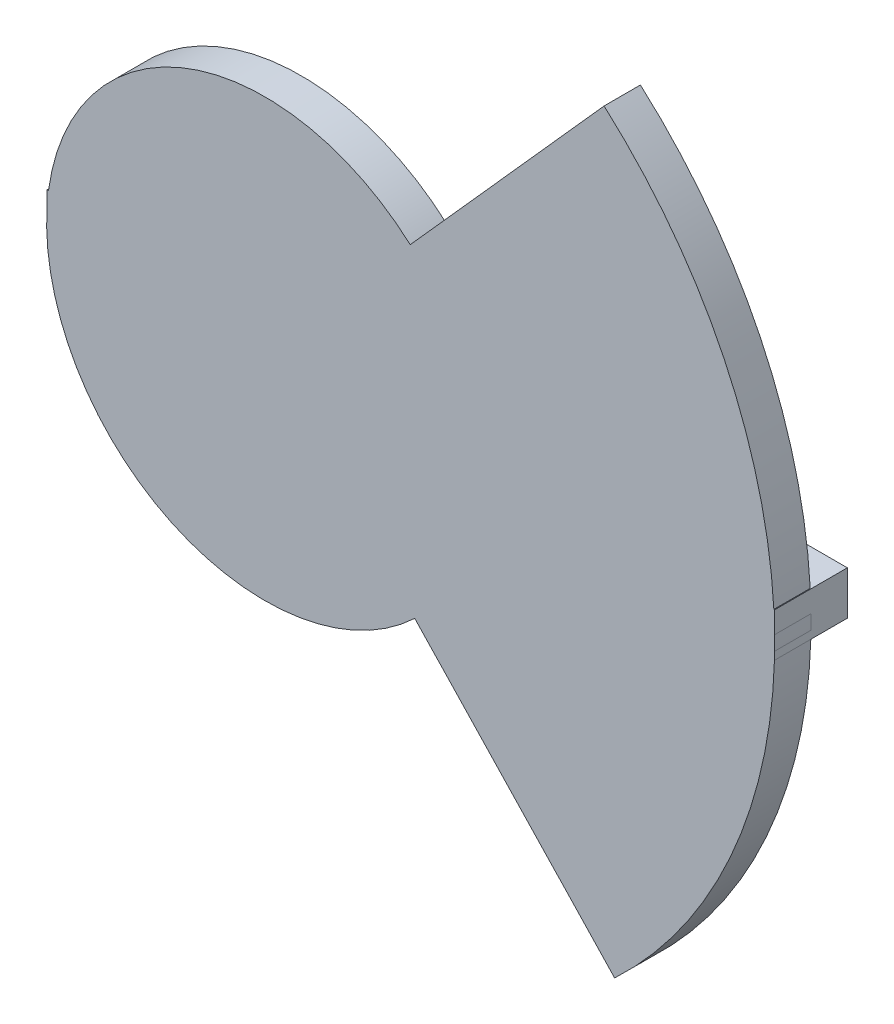
ISO-10303-21;
HEADER;
FILE_DESCRIPTION(('STEP AP214'),'2;1');
FILE_NAME('part.step','',(''),(''),'','','');
FILE_SCHEMA(('AUTOMOTIVE_DESIGN { 1 0 10303 214 1 1 1 1 }'));
ENDSEC;
DATA;
#1=APPLICATION_CONTEXT('core data for automotive mechanical design processes');
#2=APPLICATION_PROTOCOL_DEFINITION('international standard','automotive_design',2000,#1);
#3=PRODUCT_CONTEXT('',#1,'mechanical');
#4=PRODUCT('Part','Part','',(#3));
#5=PRODUCT_RELATED_PRODUCT_CATEGORY('part','',(#4));
#6=PRODUCT_DEFINITION_FORMATION('','',#4);
#7=PRODUCT_DEFINITION_CONTEXT('part definition',#1,'design');
#8=PRODUCT_DEFINITION('design','',#6,#7);
#9=PRODUCT_DEFINITION_SHAPE('','',#8);
#10=(LENGTH_UNIT() NAMED_UNIT(*) SI_UNIT(.MILLI.,.METRE.));
#11=(NAMED_UNIT(*) PLANE_ANGLE_UNIT() SI_UNIT($,.RADIAN.));
#12=(NAMED_UNIT(*) SI_UNIT($,.STERADIAN.) SOLID_ANGLE_UNIT());
#13=UNCERTAINTY_MEASURE_WITH_UNIT(LENGTH_MEASURE(1.E-05),#10,'distance_accuracy_value','');
#14=(GEOMETRIC_REPRESENTATION_CONTEXT(3) GLOBAL_UNCERTAINTY_ASSIGNED_CONTEXT((#13)) GLOBAL_UNIT_ASSIGNED_CONTEXT((#10,
#11,#12)) REPRESENTATION_CONTEXT('',''));
#15=CARTESIAN_POINT('',(0.,0.,0.));
#16=DIRECTION('',(0.,0.,1.));
#17=DIRECTION('',(1.,0.,0.));
#18=AXIS2_PLACEMENT_3D('',#15,#16,#17);
#19=CARTESIAN_POINT('',(-20.6059934785182,-1.21989896983291,-10.));
#20=DIRECTION('',(0.,0.,1.));
#21=DIRECTION('',(1.,0.,0.));
#22=AXIS2_PLACEMENT_3D('',#19,#20,#21);
#23=CYLINDRICAL_SURFACE('',#22,20.);
#24=DIRECTION('',(0.,0.,1.));
#25=VECTOR('',#24,1.);
#26=CARTESIAN_POINT('',(-40.2117720763197,2.73148630295261,-10.));
#27=LINE('',#26,#25);
#28=CARTESIAN_POINT('',(-40.2117720763197,2.73148630295261,-10.));
#29=VERTEX_POINT('',#28);
#30=CARTESIAN_POINT('',(-40.2117720763197,2.73148630295261,-5.));
#31=VERTEX_POINT('',#30);
#32=EDGE_CURVE('E310',#29,#31,#27,.T.);
#33=ORIENTED_EDGE('',*,*,#32,.T.);
#34=CARTESIAN_POINT('',(-20.6059934785182,-1.21989896983291,-5.));
#35=DIRECTION('',(0.,0.,1.));
#36=DIRECTION('',(1.,0.,0.));
#37=AXIS2_PLACEMENT_3D('',#34,#35,#36);
#38=CIRCLE('',#37,20.);
#39=CARTESIAN_POINT('',(-1.0002148807166,2.73148630295262,-5.));
#40=VERTEX_POINT('',#39);
#41=EDGE_CURVE('E262',#31,#40,#38,.F.);
#42=ORIENTED_EDGE('',*,*,#41,.T.);
#43=DIRECTION('',(0.,0.,1.));
#44=VECTOR('',#43,1.);
#45=CARTESIAN_POINT('',(-1.0002148807166,2.73148630295262,-10.));
#46=LINE('',#45,#44);
#47=CARTESIAN_POINT('',(-1.0002148807166,2.73148630295262,-10.));
#48=VERTEX_POINT('',#47);
#49=EDGE_CURVE('E308',#48,#40,#46,.T.);
#50=ORIENTED_EDGE('',*,*,#49,.F.);
#51=CARTESIAN_POINT('',(-20.6059934785182,-1.21989896983291,-10.));
#52=DIRECTION('',(0.,0.,1.));
#53=DIRECTION('',(1.,0.,0.));
#54=AXIS2_PLACEMENT_3D('',#51,#52,#53);
#55=CIRCLE('',#54,20.);
#56=EDGE_CURVE('E304',#48,#29,#55,.T.);
#57=ORIENTED_EDGE('',*,*,#56,.T.);
#58=EDGE_LOOP('',(#33,#42,#50,#57));
#59=FACE_BOUND('',#58,.T.);
#60=ADVANCED_FACE('F83',(#59),#23,.T.);
#61=CARTESIAN_POINT('',(-20.6059934785182,-1.21989896983291,-10.));
#62=DIRECTION('',(0.,0.,1.));
#63=DIRECTION('',(1.,0.,0.));
#64=AXIS2_PLACEMENT_3D('',#61,#62,#63);
#65=CYLINDRICAL_SURFACE('',#64,20.);
#66=DIRECTION('',(0.,0.,1.));
#67=VECTOR('',#66,1.);
#68=CARTESIAN_POINT('',(-0.711190697403691,-3.26851369704738,-10.));
#69=LINE('',#68,#67);
#70=CARTESIAN_POINT('',(-0.711190697403691,-3.26851369704738,-10.));
#71=VERTEX_POINT('',#70);
#72=CARTESIAN_POINT('',(-0.711190697403691,-3.26851369704738,-5.));
#73=VERTEX_POINT('',#72);
#74=EDGE_CURVE('E322',#71,#73,#69,.T.);
#75=ORIENTED_EDGE('',*,*,#74,.T.);
#76=CARTESIAN_POINT('',(-20.6059934785182,-1.21989896983291,-5.));
#77=DIRECTION('',(0.,0.,1.));
#78=DIRECTION('',(1.,0.,0.));
#79=AXIS2_PLACEMENT_3D('',#76,#77,#78);
#80=CIRCLE('',#79,20.);
#81=CARTESIAN_POINT('',(-40.5007962596326,-3.26851369704739,-5.));
#82=VERTEX_POINT('',#81);
#83=EDGE_CURVE('E283',#73,#82,#80,.F.);
#84=ORIENTED_EDGE('',*,*,#83,.T.);
#85=DIRECTION('',(0.,0.,1.));
#86=VECTOR('',#85,1.);
#87=CARTESIAN_POINT('',(-40.5007962596326,-3.26851369704739,-10.));
#88=LINE('',#87,#86);
#89=CARTESIAN_POINT('',(-40.5007962596326,-3.26851369704739,-10.));
#90=VERTEX_POINT('',#89);
#91=EDGE_CURVE('E309',#82,#90,#88,.F.);
#92=ORIENTED_EDGE('',*,*,#91,.T.);
#93=CARTESIAN_POINT('',(-20.6059934785182,-1.21989896983291,-10.));
#94=DIRECTION('',(0.,0.,1.));
#95=DIRECTION('',(1.,0.,0.));
#96=AXIS2_PLACEMENT_3D('',#93,#94,#95);
#97=CIRCLE('',#96,20.);
#98=EDGE_CURVE('E318',#90,#71,#97,.T.);
#99=ORIENTED_EDGE('',*,*,#98,.T.);
#100=EDGE_LOOP('',(#75,#84,#92,#99));
#101=FACE_BOUND('',#100,.T.);
#102=ADVANCED_FACE('F408',(#101),#65,.T.);
#103=CARTESIAN_POINT('',(49.46403529364,-3.26851369704737,-10.));
#104=DIRECTION('',(0.,1.,0.));
#105=DIRECTION('',(-1.,0.,0.));
#106=AXIS2_PLACEMENT_3D('',#103,#104,#105);
#107=PLANE('',#106);
#108=DIRECTION('',(0.,0.,1.));
#109=VECTOR('',#108,1.);
#110=CARTESIAN_POINT('',(49.4408205878097,-3.26851369704737,-5.));
#111=LINE('',#110,#109);
#112=CARTESIAN_POINT('',(49.4408205878097,-3.26851369704737,-5.));
#113=VERTEX_POINT('',#112);
#114=CARTESIAN_POINT('',(49.4408205878097,-3.26851369704737,0.));
#115=VERTEX_POINT('',#114);
#116=EDGE_CURVE('E297',#113,#115,#111,.T.);
#117=ORIENTED_EDGE('',*,*,#116,.F.);
#118=DIRECTION('',(1.,0.,0.));
#119=VECTOR('',#118,1.);
#120=CARTESIAN_POINT('',(49.46403529364,-3.26851369704737,-5.));
#121=LINE('',#120,#119);
#122=EDGE_CURVE('E287',#73,#113,#121,.T.);
#123=ORIENTED_EDGE('',*,*,#122,.F.);
#124=ORIENTED_EDGE('',*,*,#74,.F.);
#125=DIRECTION('',(-1.,0.,0.));
#126=VECTOR('',#125,1.);
#127=CARTESIAN_POINT('',(49.46403529364,-3.26851369704737,-10.));
#128=LINE('',#127,#126);
#129=CARTESIAN_POINT('',(49.46403529364,-3.26851369704737,-10.));
#130=VERTEX_POINT('',#129);
#131=EDGE_CURVE('E324',#130,#71,#128,.T.);
#132=ORIENTED_EDGE('',*,*,#131,.F.);
#133=DIRECTION('',(0.,0.,1.));
#134=VECTOR('',#133,1.);
#135=CARTESIAN_POINT('',(49.46403529364,-3.26851369704737,-10.));
#136=LINE('',#135,#134);
#137=CARTESIAN_POINT('',(49.46403529364,-3.26851369704737,0.));
#138=VERTEX_POINT('',#137);
#139=EDGE_CURVE('E341',#130,#138,#136,.T.);
#140=ORIENTED_EDGE('',*,*,#139,.T.);
#141=DIRECTION('',(-1.,0.,0.));
#142=VECTOR('',#141,1.);
#143=CARTESIAN_POINT('',(49.46403529364,-3.26851369704737,0.));
#144=LINE('',#143,#142);
#145=EDGE_CURVE('E303',#138,#115,#144,.T.);
#146=ORIENTED_EDGE('',*,*,#145,.T.);
#147=EDGE_LOOP('',(#117,#123,#124,#132,#140,#146));
#148=FACE_BOUND('',#147,.T.);
#149=ADVANCED_FACE('F85',(#148),#107,.F.);
#150=DIRECTION('',(1.,0.,0.));
#151=VECTOR('',#150,1.);
#152=CARTESIAN_POINT('',(49.46403529364,-3.26851369704737,-5.));
#153=LINE('',#152,#151);
#154=CARTESIAN_POINT('',(-50.53596470636,-3.26851369704744,-5.));
#155=VERTEX_POINT('',#154);
#156=EDGE_CURVE('E280',#155,#82,#153,.T.);
#157=ORIENTED_EDGE('',*,*,#156,.F.);
#158=DIRECTION('',(0.,0.,1.));
#159=VECTOR('',#158,1.);
#160=CARTESIAN_POINT('',(-50.53596470636,-3.26851369704739,-10.));
#161=LINE('',#160,#159);
#162=CARTESIAN_POINT('',(-50.53596470636,-3.26851369704739,-10.));
#163=VERTEX_POINT('',#162);
#164=EDGE_CURVE('E323',#163,#155,#161,.T.);
#165=ORIENTED_EDGE('',*,*,#164,.F.);
#166=EDGE_CURVE('E329',#90,#163,#128,.T.);
#167=ORIENTED_EDGE('',*,*,#166,.F.);
#168=ORIENTED_EDGE('',*,*,#91,.F.);
#169=EDGE_LOOP('',(#157,#165,#167,#168));
#170=FACE_BOUND('',#169,.T.);
#171=ADVANCED_FACE('F421',(#170),#107,.F.);
#172=CARTESIAN_POINT('',(49.46403529364,2.73148630295263,-10.));
#173=DIRECTION('',(-1.,0.,0.));
#174=DIRECTION('',(0.,0.,1.));
#175=AXIS2_PLACEMENT_3D('',#172,#173,#174);
#176=PLANE('',#175);
#177=DIRECTION('',(0.,0.,1.));
#178=VECTOR('',#177,1.);
#179=CARTESIAN_POINT('',(49.46403529364,-2.20082349392662,-5.));
#180=LINE('',#179,#178);
#181=CARTESIAN_POINT('',(49.46403529364,-2.20082349392662,0.));
#182=VERTEX_POINT('',#181);
#183=CARTESIAN_POINT('',(49.46403529364,-2.20082349392662,-5.));
#184=VERTEX_POINT('',#183);
#185=EDGE_CURVE('E294',#182,#184,#180,.F.);
#186=ORIENTED_EDGE('',*,*,#185,.F.);
#187=DIRECTION('',(0.,-1.,0.));
#188=VECTOR('',#187,1.);
#189=CARTESIAN_POINT('',(49.46403529364,2.73148630295263,0.));
#190=LINE('',#189,#188);
#191=EDGE_CURVE('E354',#182,#138,#190,.T.);
#192=ORIENTED_EDGE('',*,*,#191,.T.);
#193=ORIENTED_EDGE('',*,*,#139,.F.);
#194=DIRECTION('',(0.,-1.,0.));
#195=VECTOR('',#194,1.);
#196=CARTESIAN_POINT('',(49.46403529364,2.73148630295263,-10.));
#197=LINE('',#196,#195);
#198=CARTESIAN_POINT('',(49.46403529364,2.73148630295263,-10.));
#199=VERTEX_POINT('',#198);
#200=EDGE_CURVE('E338',#199,#130,#197,.T.);
#201=ORIENTED_EDGE('',*,*,#200,.F.);
#202=DIRECTION('',(0.,0.,1.));
#203=VECTOR('',#202,1.);
#204=CARTESIAN_POINT('',(49.46403529364,2.73148630295263,-10.));
#205=LINE('',#204,#203);
#206=CARTESIAN_POINT('',(49.46403529364,2.73148630295263,0.));
#207=VERTEX_POINT('',#206);
#208=EDGE_CURVE('E361',#199,#207,#205,.T.);
#209=ORIENTED_EDGE('',*,*,#208,.T.);
#210=CARTESIAN_POINT('',(49.46403529364,-0.232284347115188,0.));
#211=VERTEX_POINT('',#210);
#212=EDGE_CURVE('E355',#207,#211,#190,.T.);
#213=ORIENTED_EDGE('',*,*,#212,.T.);
#214=DIRECTION('',(0.,0.,1.));
#215=VECTOR('',#214,1.);
#216=CARTESIAN_POINT('',(49.46403529364,-0.232284347115188,-5.));
#217=LINE('',#216,#215);
#218=CARTESIAN_POINT('',(49.46403529364,-0.232284347115188,-5.));
#219=VERTEX_POINT('',#218);
#220=EDGE_CURVE('E99',#219,#211,#217,.T.);
#221=ORIENTED_EDGE('',*,*,#220,.F.);
#222=DIRECTION('',(0.,1.,0.));
#223=VECTOR('',#222,1.);
#224=CARTESIAN_POINT('',(49.46403529364,2.73148630295263,-5.));
#225=LINE('',#224,#223);
#226=EDGE_CURVE('E103',#184,#219,#225,.T.);
#227=ORIENTED_EDGE('',*,*,#226,.F.);
#228=EDGE_LOOP('',(#186,#192,#193,#201,#209,#213,#221,#227));
#229=FACE_BOUND('',#228,.T.);
#230=ADVANCED_FACE('F387',(#229),#176,.F.);
#231=CARTESIAN_POINT('',(49.46403529364,2.73148630295263,-10.));
#232=DIRECTION('',(0.,1.,0.));
#233=DIRECTION('',(-1.,0.,0.));
#234=AXIS2_PLACEMENT_3D('',#231,#232,#233);
#235=PLANE('',#234);
#236=DIRECTION('',(1.,0.,0.));
#237=VECTOR('',#236,1.);
#238=CARTESIAN_POINT('',(49.46403529364,2.73148630295263,-5.));
#239=LINE('',#238,#237);
#240=CARTESIAN_POINT('',(49.3592906245543,2.73148630295263,-5.));
#241=VERTEX_POINT('',#240);
#242=EDGE_CURVE('E314',#40,#241,#239,.T.);
#243=ORIENTED_EDGE('',*,*,#242,.T.);
#244=DIRECTION('',(0.,0.,1.));
#245=VECTOR('',#244,1.);
#246=CARTESIAN_POINT('',(49.3592906245543,2.73148630295263,-5.));
#247=LINE('',#246,#245);
#248=CARTESIAN_POINT('',(49.3592906245543,2.73148630295263,0.));
#249=VERTEX_POINT('',#248);
#250=EDGE_CURVE('E92',#241,#249,#247,.T.);
#251=ORIENTED_EDGE('',*,*,#250,.T.);
#252=DIRECTION('',(-1.,0.,0.));
#253=VECTOR('',#252,1.);
#254=CARTESIAN_POINT('',(49.46403529364,2.73148630295263,0.));
#255=LINE('',#254,#253);
#256=EDGE_CURVE('E350',#207,#249,#255,.T.);
#257=ORIENTED_EDGE('',*,*,#256,.F.);
#258=ORIENTED_EDGE('',*,*,#208,.F.);
#259=DIRECTION('',(-1.,0.,0.));
#260=VECTOR('',#259,1.);
#261=CARTESIAN_POINT('',(49.46403529364,2.73148630295263,-10.));
#262=LINE('',#261,#260);
#263=EDGE_CURVE('E334',#199,#48,#262,.T.);
#264=ORIENTED_EDGE('',*,*,#263,.T.);
#265=ORIENTED_EDGE('',*,*,#49,.T.);
#266=EDGE_LOOP('',(#243,#251,#257,#258,#264,#265));
#267=FACE_BOUND('',#266,.T.);
#268=ADVANCED_FACE('F380',(#267),#235,.T.);
#269=CARTESIAN_POINT('',(0.,0.,0.));
#270=DIRECTION('',(0.,0.,1.));
#271=DIRECTION('',(1.,0.,0.));
#272=AXIS2_PLACEMENT_3D('',#269,#270,#271);
#273=PLANE('',#272);
#274=DIRECTION('',(0.,-1.,0.));
#275=VECTOR('',#274,1.);
#276=CARTESIAN_POINT('',(-50.53596470636,2.73148630295261,0.));
#277=LINE('',#276,#275);
#278=CARTESIAN_POINT('',(-50.53596470636,2.73148630295261,0.));
#279=VERTEX_POINT('',#278);
#280=CARTESIAN_POINT('',(-50.53596470636,0.828715757381616,0.));
#281=VERTEX_POINT('',#280);
#282=EDGE_CURVE('E345',#279,#281,#277,.T.);
#283=ORIENTED_EDGE('',*,*,#282,.T.);
#284=CARTESIAN_POINT('',(-20.6059934785182,-1.21989896983291,0.));
#285=DIRECTION('',(0.,0.,1.));
#286=DIRECTION('',(1.,0.,0.));
#287=AXIS2_PLACEMENT_3D('',#284,#285,#286);
#288=CIRCLE('',#287,30.);
#289=CARTESIAN_POINT('',(0.,-23.0234086130823,0.));
#290=VERTEX_POINT('',#289);
#291=EDGE_CURVE('E254',#281,#290,#288,.T.);
#292=ORIENTED_EDGE('',*,*,#291,.T.);
#293=DIRECTION('',(0.686866449283939,-0.726783654774978,0.));
#294=VECTOR('',#293,1.);
#295=CARTESIAN_POINT('',(-11.4933617492112,-10.8621107851699,0.));
#296=LINE('',#295,#294);
#297=CARTESIAN_POINT('',(27.4746579713576,-52.0947548040814,0.));
#298=VERTEX_POINT('',#297);
#299=EDGE_CURVE('E240',#290,#298,#296,.T.);
#300=ORIENTED_EDGE('',*,*,#299,.T.);
#301=CARTESIAN_POINT('',(-20.3686663914693,-1.2165539205209,0.));
#302=DIRECTION('',(0.,0.,1.));
#303=DIRECTION('',(1.,0.,0.));
#304=AXIS2_PLACEMENT_3D('',#301,#302,#303);
#305=CIRCLE('',#304,69.8396378229054);
#306=EDGE_CURVE('E613',#115,#298,#305,.F.);
#307=ORIENTED_EDGE('',*,*,#306,.F.);
#308=ORIENTED_EDGE('',*,*,#145,.F.);
#309=ORIENTED_EDGE('',*,*,#191,.F.);
#310=EDGE_CURVE('E386',#211,#182,#305,.F.);
#311=ORIENTED_EDGE('',*,*,#310,.F.);
#312=ORIENTED_EDGE('',*,*,#212,.F.);
#313=ORIENTED_EDGE('',*,*,#256,.T.);
#314=CARTESIAN_POINT('',(26.0217135979081,50.9898408570901,0.));
#315=VERTEX_POINT('',#314);
#316=EDGE_CURVE('E383',#315,#249,#305,.F.);
#317=ORIENTED_EDGE('',*,*,#316,.F.);
#318=DIRECTION('',(0.666110101091804,0.7458534260989,0.));
#319=VECTOR('',#318,1.);
#320=CARTESIAN_POINT('',(-10.8569884030868,9.69620757869084,0.));
#321=LINE('',#320,#319);
#322=CARTESIAN_POINT('',(-0.622690445764052,21.1557038131341,0.));
#323=VERTEX_POINT('',#322);
#324=EDGE_CURVE('E224',#323,#315,#321,.T.);
#325=ORIENTED_EDGE('',*,*,#324,.F.);
#326=CARTESIAN_POINT('',(-50.3446308788096,2.73148630295261,0.));
#327=VERTEX_POINT('',#326);
#328=EDGE_CURVE('E247',#323,#327,#288,.T.);
#329=ORIENTED_EDGE('',*,*,#328,.T.);
#330=EDGE_CURVE('E349',#327,#279,#255,.T.);
#331=ORIENTED_EDGE('',*,*,#330,.T.);
#332=EDGE_LOOP('',(#283,#292,#300,#307,#308,#309,#311,#312,#313,#317,#325,#329,#331));
#333=FACE_BOUND('',#332,.T.);
#334=ADVANCED_FACE('F382',(#333),#273,.T.);
#335=CARTESIAN_POINT('',(0.,0.,-10.));
#336=DIRECTION('',(0.,0.,1.));
#337=DIRECTION('',(1.,0.,0.));
#338=AXIS2_PLACEMENT_3D('',#335,#336,#337);
#339=PLANE('',#338);
#340=ORIENTED_EDGE('',*,*,#56,.F.);
#341=ORIENTED_EDGE('',*,*,#263,.F.);
#342=ORIENTED_EDGE('',*,*,#200,.T.);
#343=ORIENTED_EDGE('',*,*,#131,.T.);
#344=ORIENTED_EDGE('',*,*,#98,.F.);
#345=ORIENTED_EDGE('',*,*,#166,.T.);
#346=DIRECTION('',(0.,-1.,0.));
#347=VECTOR('',#346,1.);
#348=CARTESIAN_POINT('',(-50.53596470636,2.73148630295261,-10.));
#349=LINE('',#348,#347);
#350=CARTESIAN_POINT('',(-50.53596470636,2.73148630295261,-10.));
#351=VERTEX_POINT('',#350);
#352=EDGE_CURVE('E328',#351,#163,#349,.T.);
#353=ORIENTED_EDGE('',*,*,#352,.F.);
#354=EDGE_CURVE('E333',#29,#351,#262,.T.);
#355=ORIENTED_EDGE('',*,*,#354,.F.);
#356=EDGE_LOOP('',(#340,#341,#342,#343,#344,#345,#353,#355));
#357=FACE_BOUND('',#356,.T.);
#358=ADVANCED_FACE('F426',(#357),#339,.F.);
#359=CARTESIAN_POINT('',(-50.53596470636,2.73148630295261,-10.));
#360=DIRECTION('',(-1.,0.,0.));
#361=DIRECTION('',(0.,0.,1.));
#362=AXIS2_PLACEMENT_3D('',#359,#360,#361);
#363=PLANE('',#362);
#364=DIRECTION('',(0.,0.,1.));
#365=VECTOR('',#364,1.);
#366=CARTESIAN_POINT('',(-50.53596470636,0.828715757381616,-5.));
#367=LINE('',#366,#365);
#368=CARTESIAN_POINT('',(-50.53596470636,0.828715757381616,-5.));
#369=VERTEX_POINT('',#368);
#370=EDGE_CURVE('E300',#281,#369,#367,.F.);
#371=ORIENTED_EDGE('',*,*,#370,.F.);
#372=ORIENTED_EDGE('',*,*,#282,.F.);
#373=DIRECTION('',(0.,0.,1.));
#374=VECTOR('',#373,1.);
#375=CARTESIAN_POINT('',(-50.53596470636,2.73148630295261,-10.));
#376=LINE('',#375,#374);
#377=EDGE_CURVE('E364',#351,#279,#376,.T.);
#378=ORIENTED_EDGE('',*,*,#377,.F.);
#379=ORIENTED_EDGE('',*,*,#352,.T.);
#380=ORIENTED_EDGE('',*,*,#164,.T.);
#381=DIRECTION('',(0.,1.,0.));
#382=VECTOR('',#381,1.);
#383=CARTESIAN_POINT('',(-50.53596470636,2.73148630295261,-5.));
#384=LINE('',#383,#382);
#385=EDGE_CURVE('E276',#155,#369,#384,.T.);
#386=ORIENTED_EDGE('',*,*,#385,.T.);
#387=EDGE_LOOP('',(#371,#372,#378,#379,#380,#386));
#388=FACE_BOUND('',#387,.T.);
#389=ADVANCED_FACE('F424',(#388),#363,.T.);
#390=DIRECTION('',(0.,0.,1.));
#391=VECTOR('',#390,1.);
#392=CARTESIAN_POINT('',(-50.3446308788096,2.73148630295261,-5.));
#393=LINE('',#392,#391);
#394=CARTESIAN_POINT('',(-50.3446308788096,2.73148630295261,-5.));
#395=VERTEX_POINT('',#394);
#396=EDGE_CURVE('E12',#395,#327,#393,.T.);
#397=ORIENTED_EDGE('',*,*,#396,.F.);
#398=DIRECTION('',(1.,0.,0.));
#399=VECTOR('',#398,1.);
#400=CARTESIAN_POINT('',(49.46403529364,2.73148630295263,-5.));
#401=LINE('',#400,#399);
#402=EDGE_CURVE('E272',#395,#31,#401,.T.);
#403=ORIENTED_EDGE('',*,*,#402,.T.);
#404=ORIENTED_EDGE('',*,*,#32,.F.);
#405=ORIENTED_EDGE('',*,*,#354,.T.);
#406=ORIENTED_EDGE('',*,*,#377,.T.);
#407=ORIENTED_EDGE('',*,*,#330,.F.);
#408=EDGE_LOOP('',(#397,#403,#404,#405,#406,#407));
#409=FACE_BOUND('',#408,.T.);
#410=ADVANCED_FACE('F423',(#409),#235,.T.);
#411=CARTESIAN_POINT('',(-10.8569884030868,9.69620757869084,-5.));
#412=DIRECTION('',(0.7458534260989,-0.666110101091804,0.));
#413=DIRECTION('',(0.666110101091804,0.7458534260989,0.));
#414=AXIS2_PLACEMENT_3D('',#411,#412,#413);
#415=PLANE('',#414);
#416=ORIENTED_EDGE('',*,*,#324,.T.);
#417=DIRECTION('',(0.,0.,1.));
#418=VECTOR('',#417,1.);
#419=CARTESIAN_POINT('',(26.0217135979081,50.9898408570901,-5.));
#420=LINE('',#419,#418);
#421=CARTESIAN_POINT('',(26.0217135979081,50.9898408570901,-5.));
#422=VERTEX_POINT('',#421);
#423=EDGE_CURVE('E221',#422,#315,#420,.T.);
#424=ORIENTED_EDGE('',*,*,#423,.F.);
#425=DIRECTION('',(0.666110101091804,0.7458534260989,0.));
#426=VECTOR('',#425,1.);
#427=CARTESIAN_POINT('',(-10.8569884030868,9.69620757869084,-5.));
#428=LINE('',#427,#426);
#429=CARTESIAN_POINT('',(-0.622690445764052,21.1557038131341,-5.));
#430=VERTEX_POINT('',#429);
#431=EDGE_CURVE('E208',#430,#422,#428,.T.);
#432=ORIENTED_EDGE('',*,*,#431,.F.);
#433=DIRECTION('',(0.,0.,1.));
#434=VECTOR('',#433,1.);
#435=CARTESIAN_POINT('',(-0.622690445764052,21.1557038131341,-5.));
#436=LINE('',#435,#434);
#437=EDGE_CURVE('E228',#430,#323,#436,.T.);
#438=ORIENTED_EDGE('',*,*,#437,.T.);
#439=EDGE_LOOP('',(#416,#424,#432,#438));
#440=FACE_BOUND('',#439,.T.);
#441=ADVANCED_FACE('F222',(#440),#415,.F.);
#442=CARTESIAN_POINT('',(0.,0.,-5.));
#443=DIRECTION('',(0.,0.,1.));
#444=DIRECTION('',(1.,0.,0.));
#445=AXIS2_PLACEMENT_3D('',#442,#443,#444);
#446=PLANE('',#445);
#447=ORIENTED_EDGE('',*,*,#402,.F.);
#448=CARTESIAN_POINT('',(-20.6059934785182,-1.21989896983291,-5.));
#449=DIRECTION('',(0.,0.,1.));
#450=DIRECTION('',(1.,0.,0.));
#451=AXIS2_PLACEMENT_3D('',#448,#449,#450);
#452=CIRCLE('',#451,30.);
#453=EDGE_CURVE('E215',#430,#395,#452,.T.);
#454=ORIENTED_EDGE('',*,*,#453,.F.);
#455=ORIENTED_EDGE('',*,*,#431,.T.);
#456=CARTESIAN_POINT('',(-20.3686663914693,-1.2165539205209,-5.));
#457=DIRECTION('',(0.,0.,1.));
#458=DIRECTION('',(1.,0.,0.));
#459=AXIS2_PLACEMENT_3D('',#456,#457,#458);
#460=CIRCLE('',#459,69.8396378229054);
#461=EDGE_CURVE('E212',#422,#241,#460,.F.);
#462=ORIENTED_EDGE('',*,*,#461,.T.);
#463=ORIENTED_EDGE('',*,*,#242,.F.);
#464=ORIENTED_EDGE('',*,*,#41,.F.);
#465=EDGE_LOOP('',(#447,#454,#455,#462,#463,#464));
#466=FACE_BOUND('',#465,.T.);
#467=ADVANCED_FACE('F210',(#466),#446,.F.);
#468=CARTESIAN_POINT('',(-20.3686663914693,-1.2165539205209,-5.));
#469=DIRECTION('',(0.,0.,1.));
#470=DIRECTION('',(1.,0.,0.));
#471=AXIS2_PLACEMENT_3D('',#468,#469,#470);
#472=CYLINDRICAL_SURFACE('',#471,69.8396378229054);
#473=ORIENTED_EDGE('',*,*,#250,.F.);
#474=ORIENTED_EDGE('',*,*,#461,.F.);
#475=ORIENTED_EDGE('',*,*,#423,.T.);
#476=ORIENTED_EDGE('',*,*,#316,.T.);
#477=EDGE_LOOP('',(#473,#474,#475,#476));
#478=FACE_BOUND('',#477,.T.);
#479=ADVANCED_FACE('F231',(#478),#472,.T.);
#480=CARTESIAN_POINT('',(-20.6059934785182,-1.21989896983291,-5.));
#481=DIRECTION('',(0.,0.,1.));
#482=DIRECTION('',(1.,0.,0.));
#483=AXIS2_PLACEMENT_3D('',#480,#481,#482);
#484=CYLINDRICAL_SURFACE('',#483,30.);
#485=ORIENTED_EDGE('',*,*,#453,.T.);
#486=ORIENTED_EDGE('',*,*,#396,.T.);
#487=ORIENTED_EDGE('',*,*,#328,.F.);
#488=ORIENTED_EDGE('',*,*,#437,.F.);
#489=EDGE_LOOP('',(#485,#486,#487,#488));
#490=FACE_BOUND('',#489,.T.);
#491=ADVANCED_FACE('F517',(#490),#484,.T.);
#492=CARTESIAN_POINT('',(-11.4933617492112,-10.8621107851699,-5.));
#493=DIRECTION('',(-0.726783654774978,-0.686866449283939,0.));
#494=DIRECTION('',(0.686866449283939,-0.726783654774978,0.));
#495=AXIS2_PLACEMENT_3D('',#492,#493,#494);
#496=PLANE('',#495);
#497=ORIENTED_EDGE('',*,*,#299,.F.);
#498=DIRECTION('',(0.,0.,1.));
#499=VECTOR('',#498,1.);
#500=CARTESIAN_POINT('',(0.,-23.0234086130823,-5.));
#501=LINE('',#500,#499);
#502=CARTESIAN_POINT('',(0.,-23.0234086130823,-5.));
#503=VERTEX_POINT('',#502);
#504=EDGE_CURVE('E263',#503,#290,#501,.T.);
#505=ORIENTED_EDGE('',*,*,#504,.F.);
#506=DIRECTION('',(0.686866449283939,-0.726783654774978,0.));
#507=VECTOR('',#506,1.);
#508=CARTESIAN_POINT('',(-11.4933617492112,-10.8621107851699,-5.));
#509=LINE('',#508,#507);
#510=CARTESIAN_POINT('',(27.4746579713576,-52.0947548040814,-5.));
#511=VERTEX_POINT('',#510);
#512=EDGE_CURVE('E229',#503,#511,#509,.T.);
#513=ORIENTED_EDGE('',*,*,#512,.T.);
#514=DIRECTION('',(0.,0.,1.));
#515=VECTOR('',#514,1.);
#516=CARTESIAN_POINT('',(27.4746579713576,-52.0947548040814,-5.));
#517=LINE('',#516,#515);
#518=EDGE_CURVE('E258',#511,#298,#517,.T.);
#519=ORIENTED_EDGE('',*,*,#518,.T.);
#520=EDGE_LOOP('',(#497,#505,#513,#519));
#521=FACE_BOUND('',#520,.T.);
#522=ADVANCED_FACE('F526',(#521),#496,.T.);
#523=ORIENTED_EDGE('',*,*,#385,.F.);
#524=EDGE_CURVE('E624',#369,#155,#452,.T.);
#525=ORIENTED_EDGE('',*,*,#524,.F.);
#526=EDGE_LOOP('',(#523,#525));
#527=FACE_BOUND('',#526,.T.);
#528=ADVANCED_FACE('F405',(#527),#446,.F.);
#529=ORIENTED_EDGE('',*,*,#83,.F.);
#530=ORIENTED_EDGE('',*,*,#122,.T.);
#531=EDGE_CURVE('E236',#113,#511,#460,.F.);
#532=ORIENTED_EDGE('',*,*,#531,.T.);
#533=ORIENTED_EDGE('',*,*,#512,.F.);
#534=EDGE_CURVE('E218',#155,#503,#452,.T.);
#535=ORIENTED_EDGE('',*,*,#534,.F.);
#536=ORIENTED_EDGE('',*,*,#156,.T.);
#537=EDGE_LOOP('',(#529,#530,#532,#533,#535,#536));
#538=FACE_BOUND('',#537,.T.);
#539=ADVANCED_FACE('F396',(#538),#446,.F.);
#540=ORIENTED_EDGE('',*,*,#531,.F.);
#541=ORIENTED_EDGE('',*,*,#116,.T.);
#542=ORIENTED_EDGE('',*,*,#306,.T.);
#543=ORIENTED_EDGE('',*,*,#518,.F.);
#544=EDGE_LOOP('',(#540,#541,#542,#543));
#545=FACE_BOUND('',#544,.T.);
#546=ADVANCED_FACE('F402',(#545),#472,.T.);
#547=ORIENTED_EDGE('',*,*,#291,.F.);
#548=ORIENTED_EDGE('',*,*,#370,.T.);
#549=ORIENTED_EDGE('',*,*,#524,.T.);
#550=ORIENTED_EDGE('',*,*,#534,.T.);
#551=ORIENTED_EDGE('',*,*,#504,.T.);
#552=EDGE_LOOP('',(#547,#548,#549,#550,#551));
#553=FACE_BOUND('',#552,.T.);
#554=ADVANCED_FACE('F400',(#553),#484,.T.);
#555=ORIENTED_EDGE('',*,*,#310,.T.);
#556=ORIENTED_EDGE('',*,*,#185,.T.);
#557=EDGE_CURVE('E234',#219,#184,#460,.F.);
#558=ORIENTED_EDGE('',*,*,#557,.F.);
#559=ORIENTED_EDGE('',*,*,#220,.T.);
#560=EDGE_LOOP('',(#555,#556,#558,#559));
#561=FACE_BOUND('',#560,.T.);
#562=ADVANCED_FACE('F391',(#561),#472,.T.);
#563=ORIENTED_EDGE('',*,*,#557,.T.);
#564=ORIENTED_EDGE('',*,*,#226,.T.);
#565=EDGE_LOOP('',(#563,#564));
#566=FACE_BOUND('',#565,.T.);
#567=ADVANCED_FACE('F393',(#566),#446,.F.);
#568=CLOSED_SHELL('',(#60,#102,#149,#171,#230,#268,#334,#358,#389,#410,#441,#467,#479,#491,#522,
#528,#539,#546,#554,#562,#567));
#569=MANIFOLD_SOLID_BREP('B2',#568);
#570=ADVANCED_BREP_SHAPE_REPRESENTATION('',(#18,#569),#14);
#571=SHAPE_DEFINITION_REPRESENTATION(#9,#570);
ENDSEC;
END-ISO-10303-21;
